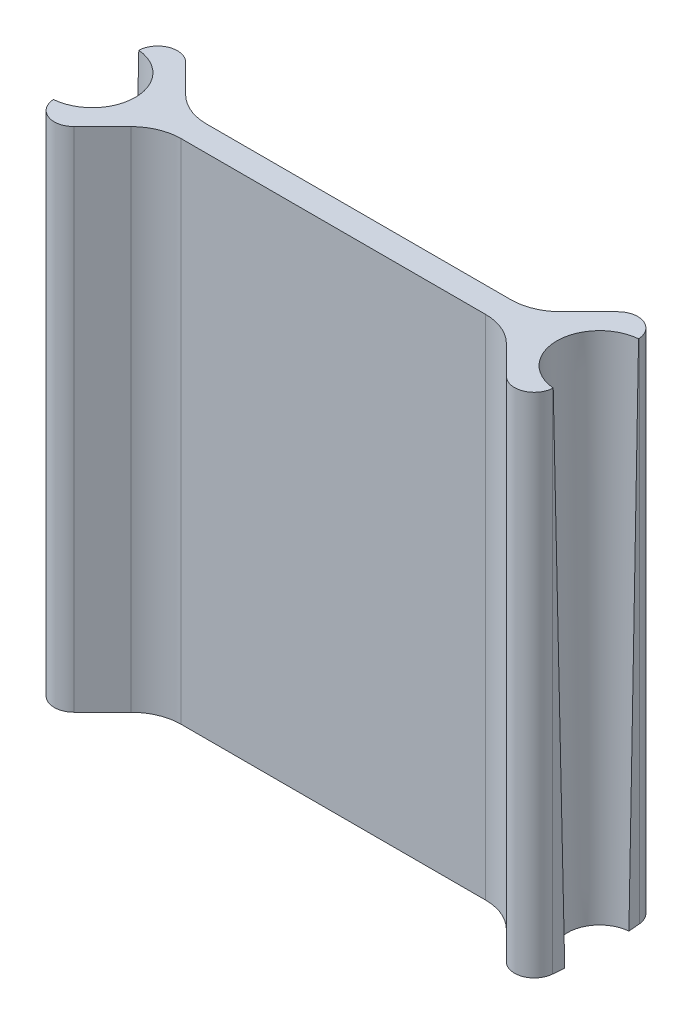
ISO-10303-21;
HEADER;
FILE_DESCRIPTION(('STEP AP214'),'2;1');
FILE_NAME('part.step','',(''),(''),'','','');
FILE_SCHEMA(('AUTOMOTIVE_DESIGN { 1 0 10303 214 1 1 1 1 }'));
ENDSEC;
DATA;
#1=APPLICATION_CONTEXT('core data for automotive mechanical design processes');
#2=APPLICATION_PROTOCOL_DEFINITION('international standard','automotive_design',2000,#1);
#3=PRODUCT_CONTEXT('',#1,'mechanical');
#4=PRODUCT('Part','Part','',(#3));
#5=PRODUCT_RELATED_PRODUCT_CATEGORY('part','',(#4));
#6=PRODUCT_DEFINITION_FORMATION('','',#4);
#7=PRODUCT_DEFINITION_CONTEXT('part definition',#1,'design');
#8=PRODUCT_DEFINITION('design','',#6,#7);
#9=PRODUCT_DEFINITION_SHAPE('','',#8);
#10=(LENGTH_UNIT() NAMED_UNIT(*) SI_UNIT(.MILLI.,.METRE.));
#11=(NAMED_UNIT(*) PLANE_ANGLE_UNIT() SI_UNIT($,.RADIAN.));
#12=(NAMED_UNIT(*) SI_UNIT($,.STERADIAN.) SOLID_ANGLE_UNIT());
#13=UNCERTAINTY_MEASURE_WITH_UNIT(LENGTH_MEASURE(1.E-05),#10,'distance_accuracy_value','');
#14=(GEOMETRIC_REPRESENTATION_CONTEXT(3) GLOBAL_UNCERTAINTY_ASSIGNED_CONTEXT((#13)) GLOBAL_UNIT_ASSIGNED_CONTEXT((#10,
#11,#12)) REPRESENTATION_CONTEXT('',''));
#15=CARTESIAN_POINT('',(0.,0.,0.));
#16=DIRECTION('',(0.,0.,1.));
#17=DIRECTION('',(1.,0.,0.));
#18=AXIS2_PLACEMENT_3D('',#15,#16,#17);
#19=CARTESIAN_POINT('',(9.92403876506105,10.,-0.868240888334609));
#20=DIRECTION('',(-0.996194698091746,0.,0.0871557427476538));
#21=DIRECTION('',(0.0871557427476538,0.,0.996194698091746));
#22=AXIS2_PLACEMENT_3D('',#19,#20,#21);
#23=PLANE('',#22);
#24=DIRECTION('',(-0.0871557427476538,0.,-0.996194698091746));
#25=VECTOR('',#24,1.);
#26=CARTESIAN_POINT('',(9.92403876506105,10.,-0.868240888334609));
#27=LINE('',#26,#25);
#28=CARTESIAN_POINT('',(9.92639957779882,10.,-0.841256675264834));
#29=VERTEX_POINT('',#28);
#30=CARTESIAN_POINT('',(9.92488614141223,10.,-0.858555332320462));
#31=VERTEX_POINT('',#30);
#32=EDGE_CURVE('E133',#29,#31,#27,.T.);
#33=ORIENTED_EDGE('',*,*,#32,.F.);
#34=DIRECTION('',(0.00182525215986721,-0.999780683474846,0.0208627276530114));
#35=VECTOR('',#34,1.);
#36=CARTESIAN_POINT('',(10.,-30.3145833930611,0.));
#37=LINE('',#36,#35);
#38=CARTESIAN_POINT('',(9.94465610335524,0.,-0.632583633288257));
#39=VERTEX_POINT('',#38);
#40=EDGE_CURVE('E441',#39,#29,#37,.F.);
#41=ORIENTED_EDGE('',*,*,#40,.F.);
#42=DIRECTION('',(-0.0871557427476538,0.,-0.996194698091746));
#43=VECTOR('',#42,1.);
#44=CARTESIAN_POINT('',(9.92403876506105,0.,-0.868240888334609));
#45=LINE('',#44,#43);
#46=CARTESIAN_POINT('',(9.92488614141223,0.,-0.858555332320462));
#47=VERTEX_POINT('',#46);
#48=EDGE_CURVE('E211',#39,#47,#45,.T.);
#49=ORIENTED_EDGE('',*,*,#48,.T.);
#50=DIRECTION('',(0.,-1.,0.));
#51=VECTOR('',#50,1.);
#52=CARTESIAN_POINT('',(9.92488614141223,10.,-0.858555332320462));
#53=LINE('',#52,#51);
#54=EDGE_CURVE('E11',#31,#47,#53,.T.);
#55=ORIENTED_EDGE('',*,*,#54,.F.);
#56=EDGE_LOOP('',(#33,#41,#49,#55));
#57=FACE_BOUND('',#56,.T.);
#58=ADVANCED_FACE('F43',(#57),#23,.F.);
#59=CARTESIAN_POINT('',(9.53691050638378,10.,-0.824611862531203));
#60=DIRECTION('',(0.,-1.,0.));
#61=DIRECTION('',(0.,0.,-1.));
#62=AXIS2_PLACEMENT_3D('',#59,#60,#61);
#63=CYLINDRICAL_SURFACE('',#62,0.389457638925042);
#64=CARTESIAN_POINT('',(9.53691050638378,0.,-0.824611862531203));
#65=DIRECTION('',(0.,1.,0.));
#66=DIRECTION('',(0.,0.,1.));
#67=AXIS2_PLACEMENT_3D('',#64,#65,#66);
#68=CIRCLE('',#67,0.389457638925042);
#69=CARTESIAN_POINT('',(9.26152236891498,0.,-1.1));
#70=VERTEX_POINT('',#69);
#71=EDGE_CURVE('E215',#47,#70,#68,.T.);
#72=ORIENTED_EDGE('',*,*,#71,.T.);
#73=DIRECTION('',(0.,-1.,0.));
#74=VECTOR('',#73,1.);
#75=CARTESIAN_POINT('',(9.26152236891498,10.,-1.1));
#76=LINE('',#75,#74);
#77=CARTESIAN_POINT('',(9.26152236891498,10.,-1.1));
#78=VERTEX_POINT('',#77);
#79=EDGE_CURVE('E52',#78,#70,#76,.T.);
#80=ORIENTED_EDGE('',*,*,#79,.F.);
#81=CARTESIAN_POINT('',(9.53691050638378,10.,-0.824611862531203));
#82=DIRECTION('',(0.,1.,0.));
#83=DIRECTION('',(0.,0.,1.));
#84=AXIS2_PLACEMENT_3D('',#81,#82,#83);
#85=CIRCLE('',#84,0.389457638925042);
#86=EDGE_CURVE('E345',#31,#78,#85,.T.);
#87=ORIENTED_EDGE('',*,*,#86,.F.);
#88=ORIENTED_EDGE('',*,*,#54,.T.);
#89=EDGE_LOOP('',(#72,#80,#87,#88));
#90=FACE_BOUND('',#89,.T.);
#91=ADVANCED_FACE('F434',(#90),#63,.T.);
#92=CARTESIAN_POINT('',(4.0807611844575,10.,4.08076118445749));
#93=DIRECTION('',(0.707106781186548,0.,0.707106781186547));
#94=DIRECTION('',(0.707106781186547,0.,-0.707106781186548));
#95=AXIS2_PLACEMENT_3D('',#92,#93,#94);
#96=PLANE('',#95);
#97=DIRECTION('',(-0.707106781186547,0.,0.707106781186548));
#98=VECTOR('',#97,1.);
#99=CARTESIAN_POINT('',(4.0807611844575,0.,4.08076118445749));
#100=LINE('',#99,#98);
#101=CARTESIAN_POINT('',(8.70251262658471,0.,-0.540990257669735));
#102=VERTEX_POINT('',#101);
#103=EDGE_CURVE('E219',#70,#102,#100,.T.);
#104=ORIENTED_EDGE('',*,*,#103,.T.);
#105=DIRECTION('',(0.,-1.,0.));
#106=VECTOR('',#105,1.);
#107=CARTESIAN_POINT('',(8.70251262658471,10.,-0.540990257669735));
#108=LINE('',#107,#106);
#109=CARTESIAN_POINT('',(8.70251262658471,10.,-0.540990257669735));
#110=VERTEX_POINT('',#109);
#111=EDGE_CURVE('E312',#110,#102,#108,.T.);
#112=ORIENTED_EDGE('',*,*,#111,.F.);
#113=DIRECTION('',(-0.707106781186547,0.,0.707106781186548));
#114=VECTOR('',#113,1.);
#115=CARTESIAN_POINT('',(4.0807611844575,10.,4.08076118445749));
#116=LINE('',#115,#114);
#117=EDGE_CURVE('E323',#78,#110,#116,.T.);
#118=ORIENTED_EDGE('',*,*,#117,.F.);
#119=ORIENTED_EDGE('',*,*,#79,.T.);
#120=EDGE_LOOP('',(#104,#112,#118,#119));
#121=FACE_BOUND('',#120,.T.);
#122=ADVANCED_FACE('F321',(#121),#96,.F.);
#123=CARTESIAN_POINT('',(8.,10.,-1.24350288425444));
#124=DIRECTION('',(0.,-1.,0.));
#125=DIRECTION('',(0.,0.,-1.));
#126=AXIS2_PLACEMENT_3D('',#123,#124,#125);
#127=CYLINDRICAL_SURFACE('',#126,0.993502884254443);
#128=CARTESIAN_POINT('',(8.,0.,-1.24350288425444));
#129=DIRECTION('',(0.,1.,0.));
#130=DIRECTION('',(0.,0.,1.));
#131=AXIS2_PLACEMENT_3D('',#128,#129,#130);
#132=CIRCLE('',#131,0.993502884254443);
#133=CARTESIAN_POINT('',(8.,0.,-0.249999999999999));
#134=VERTEX_POINT('',#133);
#135=EDGE_CURVE('E222',#102,#134,#132,.F.);
#136=ORIENTED_EDGE('',*,*,#135,.T.);
#137=DIRECTION('',(0.,-1.,0.));
#138=VECTOR('',#137,1.);
#139=CARTESIAN_POINT('',(8.,10.,-0.249999999999999));
#140=LINE('',#139,#138);
#141=CARTESIAN_POINT('',(8.,10.,-0.249999999999999));
#142=VERTEX_POINT('',#141);
#143=EDGE_CURVE('E309',#142,#134,#140,.T.);
#144=ORIENTED_EDGE('',*,*,#143,.F.);
#145=CARTESIAN_POINT('',(8.,10.,-1.24350288425444));
#146=DIRECTION('',(0.,1.,0.));
#147=DIRECTION('',(0.,0.,1.));
#148=AXIS2_PLACEMENT_3D('',#145,#146,#147);
#149=CIRCLE('',#148,0.993502884254443);
#150=EDGE_CURVE('E336',#110,#142,#149,.F.);
#151=ORIENTED_EDGE('',*,*,#150,.F.);
#152=ORIENTED_EDGE('',*,*,#111,.T.);
#153=EDGE_LOOP('',(#136,#144,#151,#152));
#154=FACE_BOUND('',#153,.T.);
#155=ADVANCED_FACE('F333',(#154),#127,.F.);
#156=CARTESIAN_POINT('',(0.,10.,-0.25));
#157=DIRECTION('',(0.,0.,-1.));
#158=DIRECTION('',(-1.,0.,0.));
#159=AXIS2_PLACEMENT_3D('',#156,#157,#158);
#160=PLANE('',#159);
#161=DIRECTION('',(1.,0.,0.));
#162=VECTOR('',#161,1.);
#163=CARTESIAN_POINT('',(0.,0.,-0.25));
#164=LINE('',#163,#162);
#165=CARTESIAN_POINT('',(2.,0.,-0.25));
#166=VERTEX_POINT('',#165);
#167=EDGE_CURVE('E226',#166,#134,#164,.T.);
#168=ORIENTED_EDGE('',*,*,#167,.F.);
#169=DIRECTION('',(0.,-1.,0.));
#170=VECTOR('',#169,1.);
#171=CARTESIAN_POINT('',(2.,10.,-0.25));
#172=LINE('',#171,#170);
#173=CARTESIAN_POINT('',(2.,10.,-0.25));
#174=VERTEX_POINT('',#173);
#175=EDGE_CURVE('E306',#174,#166,#172,.T.);
#176=ORIENTED_EDGE('',*,*,#175,.F.);
#177=DIRECTION('',(1.,0.,0.));
#178=VECTOR('',#177,1.);
#179=CARTESIAN_POINT('',(0.,10.,-0.25));
#180=LINE('',#179,#178);
#181=EDGE_CURVE('E339',#174,#142,#180,.T.);
#182=ORIENTED_EDGE('',*,*,#181,.T.);
#183=ORIENTED_EDGE('',*,*,#143,.T.);
#184=EDGE_LOOP('',(#168,#176,#182,#183));
#185=FACE_BOUND('',#184,.T.);
#186=ADVANCED_FACE('F475',(#185),#160,.T.);
#187=CARTESIAN_POINT('',(2.,10.,-1.24350288425444));
#188=DIRECTION('',(0.,-1.,0.));
#189=DIRECTION('',(0.,0.,-1.));
#190=AXIS2_PLACEMENT_3D('',#187,#188,#189);
#191=CYLINDRICAL_SURFACE('',#190,0.993502884254442);
#192=CARTESIAN_POINT('',(2.,0.,-1.24350288425444));
#193=DIRECTION('',(0.,1.,0.));
#194=DIRECTION('',(0.,0.,1.));
#195=AXIS2_PLACEMENT_3D('',#192,#193,#194);
#196=CIRCLE('',#195,0.993502884254442);
#197=CARTESIAN_POINT('',(1.29748737341529,0.,-0.540990257669733));
#198=VERTEX_POINT('',#197);
#199=EDGE_CURVE('E230',#198,#166,#196,.T.);
#200=ORIENTED_EDGE('',*,*,#199,.F.);
#201=DIRECTION('',(0.,-1.,0.));
#202=VECTOR('',#201,1.);
#203=CARTESIAN_POINT('',(1.29748737341529,10.,-0.540990257669733));
#204=LINE('',#203,#202);
#205=CARTESIAN_POINT('',(1.29748737341529,10.,-0.540990257669733));
#206=VERTEX_POINT('',#205);
#207=EDGE_CURVE('E303',#206,#198,#204,.T.);
#208=ORIENTED_EDGE('',*,*,#207,.F.);
#209=CARTESIAN_POINT('',(2.,10.,-1.24350288425444));
#210=DIRECTION('',(0.,1.,0.));
#211=DIRECTION('',(0.,0.,1.));
#212=AXIS2_PLACEMENT_3D('',#209,#210,#211);
#213=CIRCLE('',#212,0.993502884254442);
#214=EDGE_CURVE('E343',#206,#174,#213,.T.);
#215=ORIENTED_EDGE('',*,*,#214,.T.);
#216=ORIENTED_EDGE('',*,*,#175,.T.);
#217=EDGE_LOOP('',(#200,#208,#215,#216));
#218=FACE_BOUND('',#217,.T.);
#219=ADVANCED_FACE('F473',(#218),#191,.F.);
#220=CARTESIAN_POINT('',(0.919238815542513,10.,-0.919238815542511));
#221=DIRECTION('',(0.707106781186548,0.,-0.707106781186547));
#222=DIRECTION('',(-0.707106781186547,0.,-0.707106781186548));
#223=AXIS2_PLACEMENT_3D('',#220,#221,#222);
#224=PLANE('',#223);
#225=DIRECTION('',(0.707106781186547,0.,0.707106781186548));
#226=VECTOR('',#225,1.);
#227=CARTESIAN_POINT('',(0.919238815542513,0.,-0.919238815542511));
#228=LINE('',#227,#226);
#229=CARTESIAN_POINT('',(0.738477631085024,0.,-1.1));
#230=VERTEX_POINT('',#229);
#231=EDGE_CURVE('E234',#230,#198,#228,.T.);
#232=ORIENTED_EDGE('',*,*,#231,.F.);
#233=DIRECTION('',(0.,-1.,0.));
#234=VECTOR('',#233,1.);
#235=CARTESIAN_POINT('',(0.738477631085024,10.,-1.1));
#236=LINE('',#235,#234);
#237=CARTESIAN_POINT('',(0.738477631085024,10.,-1.1));
#238=VERTEX_POINT('',#237);
#239=EDGE_CURVE('E300',#238,#230,#236,.T.);
#240=ORIENTED_EDGE('',*,*,#239,.F.);
#241=DIRECTION('',(0.707106781186547,0.,0.707106781186548));
#242=VECTOR('',#241,1.);
#243=CARTESIAN_POINT('',(0.919238815542513,10.,-0.919238815542511));
#244=LINE('',#243,#242);
#245=EDGE_CURVE('E352',#238,#206,#244,.T.);
#246=ORIENTED_EDGE('',*,*,#245,.T.);
#247=ORIENTED_EDGE('',*,*,#207,.T.);
#248=EDGE_LOOP('',(#232,#240,#246,#247));
#249=FACE_BOUND('',#248,.T.);
#250=ADVANCED_FACE('F471',(#249),#224,.T.);
#251=CARTESIAN_POINT('',(0.463089493616225,10.,-0.824611862531202));
#252=DIRECTION('',(0.,-1.,0.));
#253=DIRECTION('',(0.,0.,-1.));
#254=AXIS2_PLACEMENT_3D('',#251,#252,#253);
#255=CYLINDRICAL_SURFACE('',#254,0.389457638925041);
#256=CARTESIAN_POINT('',(0.463089493616225,0.,-0.824611862531202));
#257=DIRECTION('',(0.,1.,0.));
#258=DIRECTION('',(0.,0.,1.));
#259=AXIS2_PLACEMENT_3D('',#256,#257,#258);
#260=CIRCLE('',#259,0.389457638925041);
#261=CARTESIAN_POINT('',(0.0751138585877695,0.,-0.858555332320462));
#262=VERTEX_POINT('',#261);
#263=EDGE_CURVE('E238',#262,#230,#260,.F.);
#264=ORIENTED_EDGE('',*,*,#263,.F.);
#265=DIRECTION('',(0.,-1.,0.));
#266=VECTOR('',#265,1.);
#267=CARTESIAN_POINT('',(0.0751138585877695,10.,-0.858555332320462));
#268=LINE('',#267,#266);
#269=CARTESIAN_POINT('',(0.0751138585877695,10.,-0.858555332320462));
#270=VERTEX_POINT('',#269);
#271=EDGE_CURVE('E297',#270,#262,#268,.T.);
#272=ORIENTED_EDGE('',*,*,#271,.F.);
#273=CARTESIAN_POINT('',(0.463089493616225,10.,-0.824611862531202));
#274=DIRECTION('',(0.,1.,0.));
#275=DIRECTION('',(0.,0.,1.));
#276=AXIS2_PLACEMENT_3D('',#273,#274,#275);
#277=CIRCLE('',#276,0.389457638925041);
#278=EDGE_CURVE('E356',#270,#238,#277,.F.);
#279=ORIENTED_EDGE('',*,*,#278,.T.);
#280=ORIENTED_EDGE('',*,*,#239,.T.);
#281=EDGE_LOOP('',(#264,#272,#279,#280));
#282=FACE_BOUND('',#281,.T.);
#283=ADVANCED_FACE('F467',(#282),#255,.T.);
#284=CARTESIAN_POINT('',(0.,10.,0.));
#285=DIRECTION('',(-0.996194698091746,0.,-0.0871557427476544));
#286=DIRECTION('',(-0.0871557427476544,0.,0.996194698091746));
#287=AXIS2_PLACEMENT_3D('',#284,#285,#286);
#288=PLANE('',#287);
#289=DIRECTION('',(-0.00182525215986723,-0.999780683474846,0.0208627276530114));
#290=VECTOR('',#289,1.);
#291=CARTESIAN_POINT('',(0.,-30.3145833930611,0.));
#292=LINE('',#291,#290);
#293=CARTESIAN_POINT('',(0.0553438966447605,0.,-0.632583633288259));
#294=VERTEX_POINT('',#293);
#295=CARTESIAN_POINT('',(0.0736004222011792,10.,-0.841256675264832));
#296=VERTEX_POINT('',#295);
#297=EDGE_CURVE('E407',#294,#296,#292,.F.);
#298=ORIENTED_EDGE('',*,*,#297,.T.);
#299=DIRECTION('',(0.0871557427476544,0.,-0.996194698091746));
#300=VECTOR('',#299,1.);
#301=CARTESIAN_POINT('',(0.,10.,0.));
#302=LINE('',#301,#300);
#303=EDGE_CURVE('E360',#296,#270,#302,.T.);
#304=ORIENTED_EDGE('',*,*,#303,.T.);
#305=ORIENTED_EDGE('',*,*,#271,.T.);
#306=DIRECTION('',(0.0871557427476544,0.,-0.996194698091746));
#307=VECTOR('',#306,1.);
#308=CARTESIAN_POINT('',(0.,0.,0.));
#309=LINE('',#308,#307);
#310=EDGE_CURVE('E242',#294,#262,#309,.T.);
#311=ORIENTED_EDGE('',*,*,#310,.F.);
#312=EDGE_LOOP('',(#298,#304,#305,#311));
#313=FACE_BOUND('',#312,.T.);
#314=ADVANCED_FACE('F460',(#313),#288,.T.);
#315=CARTESIAN_POINT('',(0.,10.,0.));
#316=DIRECTION('',(0.996194698091746,0.,-0.0871557427476544));
#317=DIRECTION('',(-0.0871557427476544,0.,-0.996194698091746));
#318=AXIS2_PLACEMENT_3D('',#315,#316,#317);
#319=PLANE('',#318);
#320=DIRECTION('',(0.0871557427476544,0.,0.996194698091746));
#321=VECTOR('',#320,1.);
#322=CARTESIAN_POINT('',(0.,10.,0.));
#323=LINE('',#322,#321);
#324=CARTESIAN_POINT('',(0.0736004222011792,10.,0.841256675264832));
#325=VERTEX_POINT('',#324);
#326=CARTESIAN_POINT('',(0.0751138585877695,10.,0.858555332320462));
#327=VERTEX_POINT('',#326);
#328=EDGE_CURVE('E363',#325,#327,#323,.T.);
#329=ORIENTED_EDGE('',*,*,#328,.F.);
#330=DIRECTION('',(-0.00182525215986723,-0.999780683474846,-0.0208627276530114));
#331=VECTOR('',#330,1.);
#332=CARTESIAN_POINT('',(0.,-30.3145833930611,0.));
#333=LINE('',#332,#331);
#334=CARTESIAN_POINT('',(0.0553438966447605,0.,0.632583633288259));
#335=VERTEX_POINT('',#334);
#336=EDGE_CURVE('E405',#335,#325,#333,.F.);
#337=ORIENTED_EDGE('',*,*,#336,.F.);
#338=DIRECTION('',(0.0871557427476544,0.,0.996194698091746));
#339=VECTOR('',#338,1.);
#340=CARTESIAN_POINT('',(0.,0.,0.));
#341=LINE('',#340,#339);
#342=CARTESIAN_POINT('',(0.0751138585877695,0.,0.858555332320462));
#343=VERTEX_POINT('',#342);
#344=EDGE_CURVE('E246',#335,#343,#341,.T.);
#345=ORIENTED_EDGE('',*,*,#344,.T.);
#346=DIRECTION('',(0.,-1.,0.));
#347=VECTOR('',#346,1.);
#348=CARTESIAN_POINT('',(0.0751138585877695,10.,0.858555332320462));
#349=LINE('',#348,#347);
#350=EDGE_CURVE('E293',#327,#343,#349,.T.);
#351=ORIENTED_EDGE('',*,*,#350,.F.);
#352=EDGE_LOOP('',(#329,#337,#345,#351));
#353=FACE_BOUND('',#352,.T.);
#354=ADVANCED_FACE('F413',(#353),#319,.F.);
#355=CARTESIAN_POINT('',(0.463089493616225,10.,0.824611862531202));
#356=DIRECTION('',(0.,-1.,0.));
#357=DIRECTION('',(0.,0.,-1.));
#358=AXIS2_PLACEMENT_3D('',#355,#356,#357);
#359=CYLINDRICAL_SURFACE('',#358,0.389457638925041);
#360=CARTESIAN_POINT('',(0.463089493616225,0.,0.824611862531202));
#361=DIRECTION('',(0.,1.,0.));
#362=DIRECTION('',(0.,0.,1.));
#363=AXIS2_PLACEMENT_3D('',#360,#361,#362);
#364=CIRCLE('',#363,0.389457638925041);
#365=CARTESIAN_POINT('',(0.738477631085024,0.,1.1));
#366=VERTEX_POINT('',#365);
#367=EDGE_CURVE('E249',#343,#366,#364,.T.);
#368=ORIENTED_EDGE('',*,*,#367,.T.);
#369=DIRECTION('',(0.,-1.,0.));
#370=VECTOR('',#369,1.);
#371=CARTESIAN_POINT('',(0.738477631085024,10.,1.1));
#372=LINE('',#371,#370);
#373=CARTESIAN_POINT('',(0.738477631085024,10.,1.1));
#374=VERTEX_POINT('',#373);
#375=EDGE_CURVE('E289',#374,#366,#372,.T.);
#376=ORIENTED_EDGE('',*,*,#375,.F.);
#377=CARTESIAN_POINT('',(0.463089493616225,10.,0.824611862531202));
#378=DIRECTION('',(0.,1.,0.));
#379=DIRECTION('',(0.,0.,1.));
#380=AXIS2_PLACEMENT_3D('',#377,#378,#379);
#381=CIRCLE('',#380,0.389457638925041);
#382=EDGE_CURVE('E366',#327,#374,#381,.T.);
#383=ORIENTED_EDGE('',*,*,#382,.F.);
#384=ORIENTED_EDGE('',*,*,#350,.T.);
#385=EDGE_LOOP('',(#368,#376,#383,#384));
#386=FACE_BOUND('',#385,.T.);
#387=ADVANCED_FACE('F421',(#386),#359,.T.);
#388=CARTESIAN_POINT('',(0.919238815542513,10.,0.919238815542511));
#389=DIRECTION('',(-0.707106781186548,0.,-0.707106781186547));
#390=DIRECTION('',(-0.707106781186547,0.,0.707106781186548));
#391=AXIS2_PLACEMENT_3D('',#388,#389,#390);
#392=PLANE('',#391);
#393=DIRECTION('',(0.707106781186547,0.,-0.707106781186548));
#394=VECTOR('',#393,1.);
#395=CARTESIAN_POINT('',(0.919238815542513,0.,0.919238815542511));
#396=LINE('',#395,#394);
#397=CARTESIAN_POINT('',(1.29748737341529,0.,0.540990257669733));
#398=VERTEX_POINT('',#397);
#399=EDGE_CURVE('E252',#366,#398,#396,.T.);
#400=ORIENTED_EDGE('',*,*,#399,.T.);
#401=DIRECTION('',(0.,-1.,0.));
#402=VECTOR('',#401,1.);
#403=CARTESIAN_POINT('',(1.29748737341529,10.,0.540990257669733));
#404=LINE('',#403,#402);
#405=CARTESIAN_POINT('',(1.29748737341529,10.,0.540990257669733));
#406=VERTEX_POINT('',#405);
#407=EDGE_CURVE('E285',#406,#398,#404,.T.);
#408=ORIENTED_EDGE('',*,*,#407,.F.);
#409=DIRECTION('',(0.707106781186547,0.,-0.707106781186548));
#410=VECTOR('',#409,1.);
#411=CARTESIAN_POINT('',(0.919238815542513,10.,0.919238815542511));
#412=LINE('',#411,#410);
#413=EDGE_CURVE('E369',#374,#406,#412,.T.);
#414=ORIENTED_EDGE('',*,*,#413,.F.);
#415=ORIENTED_EDGE('',*,*,#375,.T.);
#416=EDGE_LOOP('',(#400,#408,#414,#415));
#417=FACE_BOUND('',#416,.T.);
#418=ADVANCED_FACE('F424',(#417),#392,.F.);
#419=CARTESIAN_POINT('',(2.,10.,1.24350288425444));
#420=DIRECTION('',(0.,-1.,0.));
#421=DIRECTION('',(0.,0.,-1.));
#422=AXIS2_PLACEMENT_3D('',#419,#420,#421);
#423=CYLINDRICAL_SURFACE('',#422,0.993502884254442);
#424=CARTESIAN_POINT('',(2.,0.,1.24350288425444));
#425=DIRECTION('',(0.,1.,0.));
#426=DIRECTION('',(0.,0.,1.));
#427=AXIS2_PLACEMENT_3D('',#424,#425,#426);
#428=CIRCLE('',#427,0.993502884254442);
#429=CARTESIAN_POINT('',(2.,0.,0.25));
#430=VERTEX_POINT('',#429);
#431=EDGE_CURVE('E255',#398,#430,#428,.F.);
#432=ORIENTED_EDGE('',*,*,#431,.T.);
#433=DIRECTION('',(0.,-1.,0.));
#434=VECTOR('',#433,1.);
#435=CARTESIAN_POINT('',(2.,10.,0.25));
#436=LINE('',#435,#434);
#437=CARTESIAN_POINT('',(2.,10.,0.25));
#438=VERTEX_POINT('',#437);
#439=EDGE_CURVE('E281',#438,#430,#436,.T.);
#440=ORIENTED_EDGE('',*,*,#439,.F.);
#441=CARTESIAN_POINT('',(2.,10.,1.24350288425444));
#442=DIRECTION('',(0.,1.,0.));
#443=DIRECTION('',(0.,0.,1.));
#444=AXIS2_PLACEMENT_3D('',#441,#442,#443);
#445=CIRCLE('',#444,0.993502884254442);
#446=EDGE_CURVE('E372',#406,#438,#445,.F.);
#447=ORIENTED_EDGE('',*,*,#446,.F.);
#448=ORIENTED_EDGE('',*,*,#407,.T.);
#449=EDGE_LOOP('',(#432,#440,#447,#448));
#450=FACE_BOUND('',#449,.T.);
#451=ADVANCED_FACE('F380',(#450),#423,.F.);
#452=CARTESIAN_POINT('',(0.,10.,0.25));
#453=DIRECTION('',(0.,0.,-1.));
#454=DIRECTION('',(-1.,0.,0.));
#455=AXIS2_PLACEMENT_3D('',#452,#453,#454);
#456=PLANE('',#455);
#457=DIRECTION('',(1.,0.,0.));
#458=VECTOR('',#457,1.);
#459=CARTESIAN_POINT('',(0.,0.,0.25));
#460=LINE('',#459,#458);
#461=CARTESIAN_POINT('',(8.,0.,0.249999999999999));
#462=VERTEX_POINT('',#461);
#463=EDGE_CURVE('E258',#430,#462,#460,.T.);
#464=ORIENTED_EDGE('',*,*,#463,.T.);
#465=DIRECTION('',(0.,-1.,0.));
#466=VECTOR('',#465,1.);
#467=CARTESIAN_POINT('',(8.,10.,0.249999999999999));
#468=LINE('',#467,#466);
#469=CARTESIAN_POINT('',(8.,10.,0.249999999999999));
#470=VERTEX_POINT('',#469);
#471=EDGE_CURVE('E187',#470,#462,#468,.T.);
#472=ORIENTED_EDGE('',*,*,#471,.F.);
#473=DIRECTION('',(1.,0.,0.));
#474=VECTOR('',#473,1.);
#475=CARTESIAN_POINT('',(0.,10.,0.25));
#476=LINE('',#475,#474);
#477=EDGE_CURVE('E197',#438,#470,#476,.T.);
#478=ORIENTED_EDGE('',*,*,#477,.F.);
#479=ORIENTED_EDGE('',*,*,#439,.T.);
#480=EDGE_LOOP('',(#464,#472,#478,#479));
#481=FACE_BOUND('',#480,.T.);
#482=ADVANCED_FACE('F384',(#481),#456,.F.);
#483=CARTESIAN_POINT('',(8.,10.,1.24350288425444));
#484=DIRECTION('',(0.,-1.,0.));
#485=DIRECTION('',(0.,0.,-1.));
#486=AXIS2_PLACEMENT_3D('',#483,#484,#485);
#487=CYLINDRICAL_SURFACE('',#486,0.993502884254441);
#488=CARTESIAN_POINT('',(8.,0.,1.24350288425444));
#489=DIRECTION('',(0.,1.,0.));
#490=DIRECTION('',(0.,0.,1.));
#491=AXIS2_PLACEMENT_3D('',#488,#489,#490);
#492=CIRCLE('',#491,0.993502884254441);
#493=CARTESIAN_POINT('',(8.70251262658471,0.,0.540990257669735));
#494=VERTEX_POINT('',#493);
#495=EDGE_CURVE('E181',#494,#462,#492,.T.);
#496=ORIENTED_EDGE('',*,*,#495,.F.);
#497=DIRECTION('',(0.,-1.,0.));
#498=VECTOR('',#497,1.);
#499=CARTESIAN_POINT('',(8.70251262658471,10.,0.540990257669735));
#500=LINE('',#499,#498);
#501=CARTESIAN_POINT('',(8.70251262658471,10.,0.540990257669735));
#502=VERTEX_POINT('',#501);
#503=EDGE_CURVE('E176',#502,#494,#500,.T.);
#504=ORIENTED_EDGE('',*,*,#503,.F.);
#505=CARTESIAN_POINT('',(8.,10.,1.24350288425444));
#506=DIRECTION('',(0.,1.,0.));
#507=DIRECTION('',(0.,0.,1.));
#508=AXIS2_PLACEMENT_3D('',#505,#506,#507);
#509=CIRCLE('',#508,0.993502884254441);
#510=EDGE_CURVE('E179',#502,#470,#509,.T.);
#511=ORIENTED_EDGE('',*,*,#510,.T.);
#512=ORIENTED_EDGE('',*,*,#471,.T.);
#513=EDGE_LOOP('',(#496,#504,#511,#512));
#514=FACE_BOUND('',#513,.T.);
#515=ADVANCED_FACE('F178',(#514),#487,.F.);
#516=CARTESIAN_POINT('',(4.0807611844575,10.,-4.08076118445749));
#517=DIRECTION('',(-0.707106781186548,0.,0.707106781186547));
#518=DIRECTION('',(0.707106781186547,0.,0.707106781186548));
#519=AXIS2_PLACEMENT_3D('',#516,#517,#518);
#520=PLANE('',#519);
#521=DIRECTION('',(-0.707106781186547,0.,-0.707106781186548));
#522=VECTOR('',#521,1.);
#523=CARTESIAN_POINT('',(4.0807611844575,0.,-4.08076118445749));
#524=LINE('',#523,#522);
#525=CARTESIAN_POINT('',(9.26152236891498,0.,1.1));
#526=VERTEX_POINT('',#525);
#527=EDGE_CURVE('E264',#526,#494,#524,.T.);
#528=ORIENTED_EDGE('',*,*,#527,.F.);
#529=DIRECTION('',(0.,-1.,0.));
#530=VECTOR('',#529,1.);
#531=CARTESIAN_POINT('',(9.26152236891498,10.,1.1));
#532=LINE('',#531,#530);
#533=CARTESIAN_POINT('',(9.26152236891498,10.,1.1));
#534=VERTEX_POINT('',#533);
#535=EDGE_CURVE('E188',#534,#526,#532,.T.);
#536=ORIENTED_EDGE('',*,*,#535,.F.);
#537=DIRECTION('',(-0.707106781186547,0.,-0.707106781186548));
#538=VECTOR('',#537,1.);
#539=CARTESIAN_POINT('',(4.0807611844575,10.,-4.08076118445749));
#540=LINE('',#539,#538);
#541=EDGE_CURVE('E194',#534,#502,#540,.T.);
#542=ORIENTED_EDGE('',*,*,#541,.T.);
#543=ORIENTED_EDGE('',*,*,#503,.T.);
#544=EDGE_LOOP('',(#528,#536,#542,#543));
#545=FACE_BOUND('',#544,.T.);
#546=ADVANCED_FACE('F201',(#545),#520,.T.);
#547=CARTESIAN_POINT('',(9.53691050638378,10.,0.824611862531201));
#548=DIRECTION('',(0.,-1.,0.));
#549=DIRECTION('',(0.,0.,-1.));
#550=AXIS2_PLACEMENT_3D('',#547,#548,#549);
#551=CYLINDRICAL_SURFACE('',#550,0.389457638925043);
#552=CARTESIAN_POINT('',(9.53691050638378,0.,0.824611862531201));
#553=DIRECTION('',(0.,1.,0.));
#554=DIRECTION('',(0.,0.,1.));
#555=AXIS2_PLACEMENT_3D('',#552,#553,#554);
#556=CIRCLE('',#555,0.389457638925043);
#557=CARTESIAN_POINT('',(9.92488614141223,0.,0.858555332320462));
#558=VERTEX_POINT('',#557);
#559=EDGE_CURVE('E267',#558,#526,#556,.F.);
#560=ORIENTED_EDGE('',*,*,#559,.F.);
#561=DIRECTION('',(0.,-1.,0.));
#562=VECTOR('',#561,1.);
#563=CARTESIAN_POINT('',(9.92488614141223,10.,0.858555332320462));
#564=LINE('',#563,#562);
#565=CARTESIAN_POINT('',(9.92488614141223,10.,0.858555332320462));
#566=VERTEX_POINT('',#565);
#567=EDGE_CURVE('E117',#566,#558,#564,.T.);
#568=ORIENTED_EDGE('',*,*,#567,.F.);
#569=CARTESIAN_POINT('',(9.53691050638378,10.,0.824611862531201));
#570=DIRECTION('',(0.,1.,0.));
#571=DIRECTION('',(0.,0.,1.));
#572=AXIS2_PLACEMENT_3D('',#569,#570,#571);
#573=CIRCLE('',#572,0.389457638925043);
#574=EDGE_CURVE('E203',#566,#534,#573,.F.);
#575=ORIENTED_EDGE('',*,*,#574,.T.);
#576=ORIENTED_EDGE('',*,*,#535,.T.);
#577=EDGE_LOOP('',(#560,#568,#575,#576));
#578=FACE_BOUND('',#577,.T.);
#579=ADVANCED_FACE('F386',(#578),#551,.T.);
#580=CARTESIAN_POINT('',(9.92403876506105,10.,0.868240888334609));
#581=DIRECTION('',(0.996194698091746,0.,0.0871557427476538));
#582=DIRECTION('',(0.0871557427476538,0.,-0.996194698091746));
#583=AXIS2_PLACEMENT_3D('',#580,#581,#582);
#584=PLANE('',#583);
#585=DIRECTION('',(0.00182525215986721,-0.999780683474846,-0.0208627276530114));
#586=VECTOR('',#585,1.);
#587=CARTESIAN_POINT('',(10.,-30.3145833930611,0.));
#588=LINE('',#587,#586);
#589=CARTESIAN_POINT('',(9.94465610335524,0.,0.632583633288257));
#590=VERTEX_POINT('',#589);
#591=CARTESIAN_POINT('',(9.92639957779882,10.,0.841256675264832));
#592=VERTEX_POINT('',#591);
#593=EDGE_CURVE('E124',#590,#592,#588,.F.);
#594=ORIENTED_EDGE('',*,*,#593,.T.);
#595=DIRECTION('',(-0.0871557427476538,0.,0.996194698091746));
#596=VECTOR('',#595,1.);
#597=CARTESIAN_POINT('',(9.92403876506105,10.,0.868240888334609));
#598=LINE('',#597,#596);
#599=EDGE_CURVE('E60',#592,#566,#598,.T.);
#600=ORIENTED_EDGE('',*,*,#599,.T.);
#601=ORIENTED_EDGE('',*,*,#567,.T.);
#602=DIRECTION('',(-0.0871557427476538,0.,0.996194698091746));
#603=VECTOR('',#602,1.);
#604=CARTESIAN_POINT('',(9.92403876506105,0.,0.868240888334609));
#605=LINE('',#604,#603);
#606=EDGE_CURVE('E271',#590,#558,#605,.T.);
#607=ORIENTED_EDGE('',*,*,#606,.F.);
#608=EDGE_LOOP('',(#594,#600,#601,#607));
#609=FACE_BOUND('',#608,.T.);
#610=ADVANCED_FACE('F572',(#609),#584,.T.);
#611=CARTESIAN_POINT('',(0.,10.,0.));
#612=DIRECTION('',(0.,1.,0.));
#613=DIRECTION('',(0.,0.,1.));
#614=AXIS2_PLACEMENT_3D('',#611,#612,#613);
#615=PLANE('',#614);
#616=CARTESIAN_POINT('',(0.,10.,0.));
#617=DIRECTION('',(0.,1.,0.));
#618=DIRECTION('',(0.,0.,1.));
#619=AXIS2_PLACEMENT_3D('',#616,#617,#618);
#620=CIRCLE('',#619,0.8444701390966);
#621=EDGE_CURVE('E216',#296,#325,#620,.F.);
#622=ORIENTED_EDGE('',*,*,#621,.T.);
#623=ORIENTED_EDGE('',*,*,#328,.T.);
#624=ORIENTED_EDGE('',*,*,#382,.T.);
#625=ORIENTED_EDGE('',*,*,#413,.T.);
#626=ORIENTED_EDGE('',*,*,#446,.T.);
#627=ORIENTED_EDGE('',*,*,#477,.T.);
#628=ORIENTED_EDGE('',*,*,#510,.F.);
#629=ORIENTED_EDGE('',*,*,#541,.F.);
#630=ORIENTED_EDGE('',*,*,#574,.F.);
#631=ORIENTED_EDGE('',*,*,#599,.F.);
#632=CARTESIAN_POINT('',(10.,10.,0.));
#633=DIRECTION('',(0.,1.,0.));
#634=DIRECTION('',(0.,0.,1.));
#635=AXIS2_PLACEMENT_3D('',#632,#633,#634);
#636=CIRCLE('',#635,0.844470139096601);
#637=EDGE_CURVE('E388',#592,#29,#636,.F.);
#638=ORIENTED_EDGE('',*,*,#637,.T.);
#639=ORIENTED_EDGE('',*,*,#32,.T.);
#640=ORIENTED_EDGE('',*,*,#86,.T.);
#641=ORIENTED_EDGE('',*,*,#117,.T.);
#642=ORIENTED_EDGE('',*,*,#150,.T.);
#643=ORIENTED_EDGE('',*,*,#181,.F.);
#644=ORIENTED_EDGE('',*,*,#214,.F.);
#645=ORIENTED_EDGE('',*,*,#245,.F.);
#646=ORIENTED_EDGE('',*,*,#278,.F.);
#647=ORIENTED_EDGE('',*,*,#303,.F.);
#648=EDGE_LOOP('',(#622,#623,#624,#625,#626,#627,#628,#629,#630,#631,#638,#639,#640,#641,#642,
#643,#644,#645,#646,#647));
#649=FACE_BOUND('',#648,.T.);
#650=ADVANCED_FACE('F192',(#649),#615,.T.);
#651=CARTESIAN_POINT('',(0.,0.,0.));
#652=DIRECTION('',(0.,1.,0.));
#653=DIRECTION('',(0.,0.,1.));
#654=AXIS2_PLACEMENT_3D('',#651,#652,#653);
#655=PLANE('',#654);
#656=ORIENTED_EDGE('',*,*,#344,.F.);
#657=CARTESIAN_POINT('',(0.,0.,0.));
#658=DIRECTION('',(0.,-1.,0.));
#659=DIRECTION('',(0.,0.,-1.));
#660=AXIS2_PLACEMENT_3D('',#657,#658,#659);
#661=CIRCLE('',#660,0.635);
#662=EDGE_CURVE('E402',#294,#335,#661,.T.);
#663=ORIENTED_EDGE('',*,*,#662,.F.);
#664=ORIENTED_EDGE('',*,*,#310,.T.);
#665=ORIENTED_EDGE('',*,*,#263,.T.);
#666=ORIENTED_EDGE('',*,*,#231,.T.);
#667=ORIENTED_EDGE('',*,*,#199,.T.);
#668=ORIENTED_EDGE('',*,*,#167,.T.);
#669=ORIENTED_EDGE('',*,*,#135,.F.);
#670=ORIENTED_EDGE('',*,*,#103,.F.);
#671=ORIENTED_EDGE('',*,*,#71,.F.);
#672=ORIENTED_EDGE('',*,*,#48,.F.);
#673=CARTESIAN_POINT('',(10.,0.,0.));
#674=DIRECTION('',(0.,-1.,0.));
#675=DIRECTION('',(0.,0.,-1.));
#676=AXIS2_PLACEMENT_3D('',#673,#674,#675);
#677=CIRCLE('',#676,0.635000000000001);
#678=EDGE_CURVE('E448',#590,#39,#677,.T.);
#679=ORIENTED_EDGE('',*,*,#678,.F.);
#680=ORIENTED_EDGE('',*,*,#606,.T.);
#681=ORIENTED_EDGE('',*,*,#559,.T.);
#682=ORIENTED_EDGE('',*,*,#527,.T.);
#683=ORIENTED_EDGE('',*,*,#495,.T.);
#684=ORIENTED_EDGE('',*,*,#463,.F.);
#685=ORIENTED_EDGE('',*,*,#431,.F.);
#686=ORIENTED_EDGE('',*,*,#399,.F.);
#687=ORIENTED_EDGE('',*,*,#367,.F.);
#688=EDGE_LOOP('',(#656,#663,#664,#665,#666,#667,#668,#669,#670,#671,#672,#679,#680,#681,#682,
#683,#684,#685,#686,#687));
#689=FACE_BOUND('',#688,.T.);
#690=ADVANCED_FACE('F328',(#689),#655,.F.);
#691=CARTESIAN_POINT('',(10.,0.,0.));
#692=DIRECTION('',(0.,1.,0.));
#693=DIRECTION('',(0.,0.,-1.));
#694=AXIS2_PLACEMENT_3D('',#691,#692,#693);
#695=CONICAL_SURFACE('',#694,0.635000000000001,0.020943951023932);
#696=ORIENTED_EDGE('',*,*,#40,.T.);
#697=ORIENTED_EDGE('',*,*,#637,.F.);
#698=ORIENTED_EDGE('',*,*,#593,.F.);
#699=ORIENTED_EDGE('',*,*,#678,.T.);
#700=EDGE_LOOP('',(#696,#697,#698,#699));
#701=FACE_BOUND('',#700,.T.);
#702=ADVANCED_FACE('F619',(#701),#695,.F.);
#703=CARTESIAN_POINT('',(0.,0.,0.));
#704=DIRECTION('',(0.,1.,0.));
#705=DIRECTION('',(0.,0.,-1.));
#706=AXIS2_PLACEMENT_3D('',#703,#704,#705);
#707=CONICAL_SURFACE('',#706,0.635,0.020943951023932);
#708=ORIENTED_EDGE('',*,*,#662,.T.);
#709=ORIENTED_EDGE('',*,*,#336,.T.);
#710=ORIENTED_EDGE('',*,*,#621,.F.);
#711=ORIENTED_EDGE('',*,*,#297,.F.);
#712=EDGE_LOOP('',(#708,#709,#710,#711));
#713=FACE_BOUND('',#712,.T.);
#714=ADVANCED_FACE('F404',(#713),#707,.F.);
#715=CLOSED_SHELL('',(#58,#91,#122,#155,#186,#219,#250,#283,#314,#354,#387,#418,#451,#482,#515,
#546,#579,#610,#650,#690,#702,#714));
#716=MANIFOLD_SOLID_BREP('B2',#715);
#717=ADVANCED_BREP_SHAPE_REPRESENTATION('',(#18,#716),#14);
#718=SHAPE_DEFINITION_REPRESENTATION(#9,#717);
ENDSEC;
END-ISO-10303-21;
